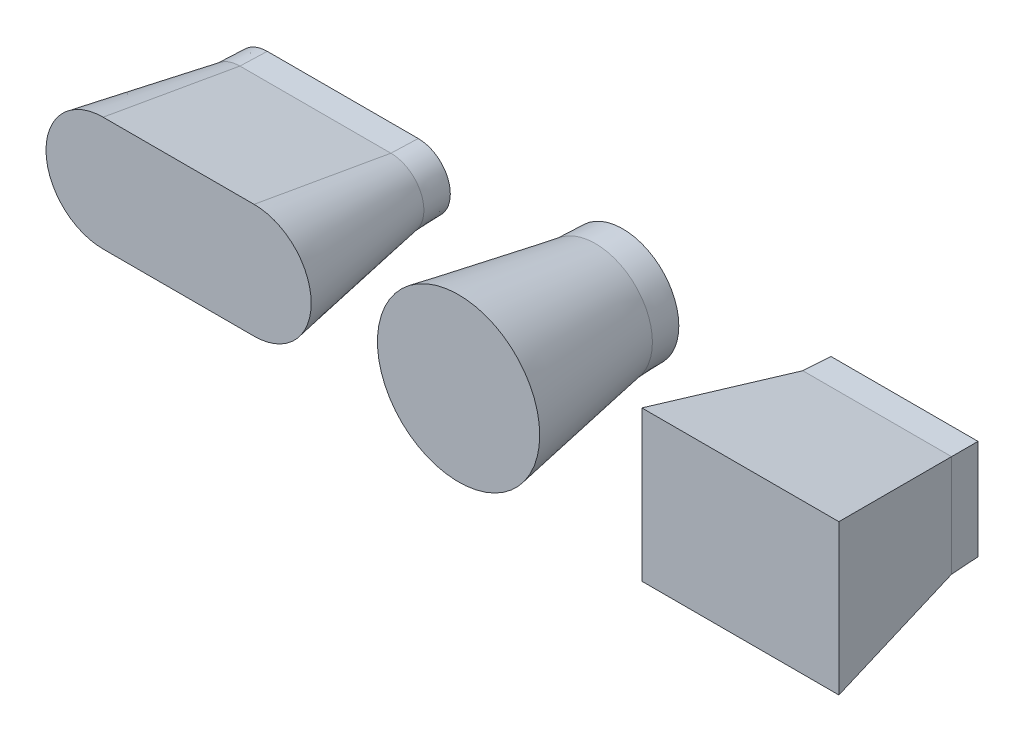
ISO-10303-21;
HEADER;
FILE_DESCRIPTION(('STEP AP214'),'2;1');
FILE_NAME('part.step','',(''),(''),'','','');
FILE_SCHEMA(('AUTOMOTIVE_DESIGN { 1 0 10303 214 1 1 1 1 }'));
ENDSEC;
DATA;
#1=APPLICATION_CONTEXT('core data for automotive mechanical design processes');
#2=APPLICATION_PROTOCOL_DEFINITION('international standard','automotive_design',2000,#1);
#3=PRODUCT_CONTEXT('',#1,'mechanical');
#4=PRODUCT('Part','Part','',(#3));
#5=PRODUCT_RELATED_PRODUCT_CATEGORY('part','',(#4));
#6=PRODUCT_DEFINITION_FORMATION('','',#4);
#7=PRODUCT_DEFINITION_CONTEXT('part definition',#1,'design');
#8=PRODUCT_DEFINITION('design','',#6,#7);
#9=PRODUCT_DEFINITION_SHAPE('','',#8);
#10=(LENGTH_UNIT() NAMED_UNIT(*) SI_UNIT(.MILLI.,.METRE.));
#11=(NAMED_UNIT(*) PLANE_ANGLE_UNIT() SI_UNIT($,.RADIAN.));
#12=(NAMED_UNIT(*) SI_UNIT($,.STERADIAN.) SOLID_ANGLE_UNIT());
#13=UNCERTAINTY_MEASURE_WITH_UNIT(LENGTH_MEASURE(1.E-05),#10,'distance_accuracy_value','');
#14=(GEOMETRIC_REPRESENTATION_CONTEXT(3) GLOBAL_UNCERTAINTY_ASSIGNED_CONTEXT((#13)) GLOBAL_UNIT_ASSIGNED_CONTEXT((#10,
#11,#12)) REPRESENTATION_CONTEXT('',''));
#15=CARTESIAN_POINT('',(0.,0.,0.));
#16=DIRECTION('',(0.,0.,1.));
#17=DIRECTION('',(1.,0.,0.));
#18=AXIS2_PLACEMENT_3D('',#15,#16,#17);
#19=CARTESIAN_POINT('',(49.8176364889845,31.4708187497617,0.));
#20=DIRECTION('',(-0.999390827019096,0.,-0.034899496702501));
#21=DIRECTION('',(-0.034899496702501,0.,0.999390827019096));
#22=AXIS2_PLACEMENT_3D('',#19,#20,#21);
#23=PLANE('',#22);
#24=DIRECTION('',(0.,-1.,0.));
#25=VECTOR('',#24,1.);
#26=CARTESIAN_POINT('',(49.8176364889845,31.4708187497617,0.));
#27=LINE('',#26,#25);
#28=CARTESIAN_POINT('',(49.8176364889845,31.4708187497617,0.));
#29=VERTEX_POINT('',#28);
#30=CARTESIAN_POINT('',(49.8176364889845,-5.7584902393181,0.));
#31=VERTEX_POINT('',#30);
#32=EDGE_CURVE('E107',#29,#31,#27,.T.);
#33=ORIENTED_EDGE('',*,*,#32,.F.);
#34=DIRECTION('',(-0.0348782627423747,0.0348782627423747,0.998782765958718));
#35=VECTOR('',#34,1.);
#36=CARTESIAN_POINT('',(49.8176364889845,31.4708187497617,0.));
#37=LINE('',#36,#35);
#38=CARTESIAN_POINT('',(50.166844183902,31.1216110548443,-10.));
#39=VERTEX_POINT('',#38);
#40=EDGE_CURVE('E12',#39,#29,#37,.T.);
#41=ORIENTED_EDGE('',*,*,#40,.F.);
#42=DIRECTION('',(0.,-1.,0.));
#43=VECTOR('',#42,1.);
#44=CARTESIAN_POINT('',(50.166844183902,0.,-10.));
#45=LINE('',#44,#43);
#46=CARTESIAN_POINT('',(50.166844183902,-5.40928254440062,-10.));
#47=VERTEX_POINT('',#46);
#48=EDGE_CURVE('E130',#39,#47,#45,.T.);
#49=ORIENTED_EDGE('',*,*,#48,.T.);
#50=DIRECTION('',(-0.0348782627423746,-0.0348782627423747,0.998782765958718));
#51=VECTOR('',#50,1.);
#52=CARTESIAN_POINT('',(49.8629256906544,-5.71320103764818,-1.29691305000075));
#53=LINE('',#52,#51);
#54=EDGE_CURVE('E85',#47,#31,#53,.T.);
#55=ORIENTED_EDGE('',*,*,#54,.T.);
#56=EDGE_LOOP('',(#33,#41,#49,#55));
#57=FACE_BOUND('',#56,.T.);
#58=ADVANCED_FACE('F48',(#57),#23,.T.);
#59=CARTESIAN_POINT('',(49.8176364889845,31.4708187497617,0.));
#60=DIRECTION('',(0.,0.999390827019096,-0.034899496702501));
#61=DIRECTION('',(0.,0.034899496702501,0.999390827019096));
#62=AXIS2_PLACEMENT_3D('',#59,#60,#61);
#63=PLANE('',#62);
#64=DIRECTION('',(-1.,0.,0.));
#65=VECTOR('',#64,1.);
#66=CARTESIAN_POINT('',(49.8176364889845,31.4708187497617,0.));
#67=LINE('',#66,#65);
#68=CARTESIAN_POINT('',(104.18849781836,31.4708187497617,0.));
#69=VERTEX_POINT('',#68);
#70=EDGE_CURVE('E117',#69,#29,#67,.T.);
#71=ORIENTED_EDGE('',*,*,#70,.F.);
#72=DIRECTION('',(0.0348782627423747,0.0348782627423747,0.998782765958718));
#73=VECTOR('',#72,1.);
#74=CARTESIAN_POINT('',(104.18849781836,31.4708187497617,0.));
#75=LINE('',#74,#73);
#76=CARTESIAN_POINT('',(103.839290123443,31.1216110548443,-10.));
#77=VERTEX_POINT('',#76);
#78=EDGE_CURVE('E58',#77,#69,#75,.T.);
#79=ORIENTED_EDGE('',*,*,#78,.F.);
#80=DIRECTION('',(-1.,0.,0.));
#81=VECTOR('',#80,1.);
#82=CARTESIAN_POINT('',(0.,31.1216110548443,-10.));
#83=LINE('',#82,#81);
#84=EDGE_CURVE('E120',#77,#39,#83,.T.);
#85=ORIENTED_EDGE('',*,*,#84,.T.);
#86=ORIENTED_EDGE('',*,*,#40,.T.);
#87=EDGE_LOOP('',(#71,#79,#85,#86));
#88=FACE_BOUND('',#87,.T.);
#89=ADVANCED_FACE('F50',(#88),#63,.T.);
#90=CARTESIAN_POINT('',(104.18849781836,31.4708187497617,0.));
#91=DIRECTION('',(0.999390827019096,0.,-0.034899496702501));
#92=DIRECTION('',(-0.034899496702501,0.,-0.999390827019096));
#93=AXIS2_PLACEMENT_3D('',#90,#91,#92);
#94=PLANE('',#93);
#95=DIRECTION('',(0.,1.,0.));
#96=VECTOR('',#95,1.);
#97=CARTESIAN_POINT('',(104.18849781836,31.4708187497617,0.));
#98=LINE('',#97,#96);
#99=CARTESIAN_POINT('',(104.18849781836,-5.7584902393181,0.));
#100=VERTEX_POINT('',#99);
#101=EDGE_CURVE('E131',#100,#69,#98,.T.);
#102=ORIENTED_EDGE('',*,*,#101,.F.);
#103=DIRECTION('',(0.0348782627423747,-0.0348782627423747,0.998782765958718));
#104=VECTOR('',#103,1.);
#105=CARTESIAN_POINT('',(104.122356034626,-5.69234845558434,-1.89405287158383));
#106=LINE('',#105,#104);
#107=CARTESIAN_POINT('',(103.839290123443,-5.40928254440062,-10.));
#108=VERTEX_POINT('',#107);
#109=EDGE_CURVE('E78',#108,#100,#106,.T.);
#110=ORIENTED_EDGE('',*,*,#109,.F.);
#111=DIRECTION('',(0.,1.,0.));
#112=VECTOR('',#111,1.);
#113=CARTESIAN_POINT('',(103.839290123443,0.,-10.));
#114=LINE('',#113,#112);
#115=EDGE_CURVE('E157',#108,#77,#114,.T.);
#116=ORIENTED_EDGE('',*,*,#115,.T.);
#117=ORIENTED_EDGE('',*,*,#78,.T.);
#118=EDGE_LOOP('',(#102,#110,#116,#117));
#119=FACE_BOUND('',#118,.T.);
#120=ADVANCED_FACE('F169',(#119),#94,.T.);
#121=CARTESIAN_POINT('',(49.8176364889845,-5.7584902393181,0.));
#122=DIRECTION('',(0.,-0.999390827019096,-0.034899496702501));
#123=DIRECTION('',(0.,0.034899496702501,-0.999390827019096));
#124=AXIS2_PLACEMENT_3D('',#121,#122,#123);
#125=PLANE('',#124);
#126=DIRECTION('',(1.,0.,0.));
#127=VECTOR('',#126,1.);
#128=CARTESIAN_POINT('',(49.8176364889845,-5.7584902393181,0.));
#129=LINE('',#128,#127);
#130=EDGE_CURVE('E111',#31,#100,#129,.T.);
#131=ORIENTED_EDGE('',*,*,#130,.F.);
#132=ORIENTED_EDGE('',*,*,#54,.F.);
#133=DIRECTION('',(1.,0.,0.));
#134=VECTOR('',#133,1.);
#135=CARTESIAN_POINT('',(0.,-5.40928254440062,-10.));
#136=LINE('',#135,#134);
#137=EDGE_CURVE('E52',#47,#108,#136,.T.);
#138=ORIENTED_EDGE('',*,*,#137,.T.);
#139=ORIENTED_EDGE('',*,*,#109,.T.);
#140=EDGE_LOOP('',(#131,#132,#138,#139));
#141=FACE_BOUND('',#140,.T.);
#142=ADVANCED_FACE('F158',(#141),#125,.T.);
#143=CARTESIAN_POINT('',(0.,0.,-10.));
#144=DIRECTION('',(0.,0.,1.));
#145=DIRECTION('',(1.,0.,0.));
#146=AXIS2_PLACEMENT_3D('',#143,#144,#145);
#147=PLANE('',#146);
#148=ORIENTED_EDGE('',*,*,#48,.F.);
#149=ORIENTED_EDGE('',*,*,#84,.F.);
#150=ORIENTED_EDGE('',*,*,#115,.F.);
#151=ORIENTED_EDGE('',*,*,#137,.F.);
#152=EDGE_LOOP('',(#148,#149,#150,#151));
#153=FACE_BOUND('',#152,.T.);
#154=ADVANCED_FACE('F160',(#153),#147,.F.);
#155=CARTESIAN_POINT('',(49.8176364889845,31.4708187497617,0.));
#156=DIRECTION('',(-0.984807753012208,0.,-0.17364817766693));
#157=DIRECTION('',(-0.17364817766693,0.,0.984807753012208));
#158=AXIS2_PLACEMENT_3D('',#155,#156,#157);
#159=PLANE('',#158);
#160=ORIENTED_EDGE('',*,*,#32,.T.);
#161=DIRECTION('',(0.171087869746036,0.171087869746036,-0.970287525247814));
#162=VECTOR('',#161,1.);
#163=CARTESIAN_POINT('',(49.8176364889845,-5.7584902393181,0.));
#164=LINE('',#163,#162);
#165=CARTESIAN_POINT('',(41.0012874535613,-14.5748392747413,50.));
#166=VERTEX_POINT('',#165);
#167=EDGE_CURVE('E112',#166,#31,#164,.T.);
#168=ORIENTED_EDGE('',*,*,#167,.F.);
#169=DIRECTION('',(0.,1.,0.));
#170=VECTOR('',#169,1.);
#171=CARTESIAN_POINT('',(41.0012874535613,31.4708187497617,50.));
#172=LINE('',#171,#170);
#173=CARTESIAN_POINT('',(41.0012874535613,40.287167785185,50.));
#174=VERTEX_POINT('',#173);
#175=EDGE_CURVE('E135',#174,#166,#172,.F.);
#176=ORIENTED_EDGE('',*,*,#175,.F.);
#177=DIRECTION('',(0.171087869746036,-0.171087869746036,-0.970287525247814));
#178=VECTOR('',#177,1.);
#179=CARTESIAN_POINT('',(49.8176364889845,31.4708187497617,0.));
#180=LINE('',#179,#178);
#181=EDGE_CURVE('E126',#174,#29,#180,.T.);
#182=ORIENTED_EDGE('',*,*,#181,.T.);
#183=EDGE_LOOP('',(#160,#168,#176,#182));
#184=FACE_BOUND('',#183,.T.);
#185=ADVANCED_FACE('F133',(#184),#159,.T.);
#186=CARTESIAN_POINT('',(49.8176364889845,-5.7584902393181,0.));
#187=DIRECTION('',(0.,-0.984807753012208,-0.17364817766693));
#188=DIRECTION('',(0.,0.17364817766693,-0.984807753012208));
#189=AXIS2_PLACEMENT_3D('',#186,#187,#188);
#190=PLANE('',#189);
#191=ORIENTED_EDGE('',*,*,#130,.T.);
#192=DIRECTION('',(-0.171087869746036,0.171087869746036,-0.970287525247814));
#193=VECTOR('',#192,1.);
#194=CARTESIAN_POINT('',(103.098756511925,-4.66874893288281,-6.1802300592729));
#195=LINE('',#194,#193);
#196=CARTESIAN_POINT('',(113.004846853783,-14.5748392747413,50.));
#197=VERTEX_POINT('',#196);
#198=EDGE_CURVE('E138',#197,#100,#195,.T.);
#199=ORIENTED_EDGE('',*,*,#198,.F.);
#200=DIRECTION('',(-1.,0.,0.));
#201=VECTOR('',#200,1.);
#202=CARTESIAN_POINT('',(49.8176364889845,-14.5748392747413,50.));
#203=LINE('',#202,#201);
#204=EDGE_CURVE('E147',#166,#197,#203,.F.);
#205=ORIENTED_EDGE('',*,*,#204,.F.);
#206=ORIENTED_EDGE('',*,*,#167,.T.);
#207=EDGE_LOOP('',(#191,#199,#205,#206));
#208=FACE_BOUND('',#207,.T.);
#209=ADVANCED_FACE('F167',(#208),#190,.T.);
#210=CARTESIAN_POINT('',(104.18849781836,31.4708187497617,0.));
#211=DIRECTION('',(0.984807753012208,0.,-0.17364817766693));
#212=DIRECTION('',(-0.17364817766693,0.,-0.984807753012208));
#213=AXIS2_PLACEMENT_3D('',#210,#211,#212);
#214=PLANE('',#213);
#215=ORIENTED_EDGE('',*,*,#101,.T.);
#216=DIRECTION('',(-0.171087869746036,-0.171087869746036,-0.970287525247814));
#217=VECTOR('',#216,1.);
#218=CARTESIAN_POINT('',(102.597005119034,29.8793260504354,-9.02580361174387));
#219=LINE('',#218,#217);
#220=CARTESIAN_POINT('',(113.004846853783,40.287167785185,50.));
#221=VERTEX_POINT('',#220);
#222=EDGE_CURVE('E129',#221,#69,#219,.T.);
#223=ORIENTED_EDGE('',*,*,#222,.F.);
#224=DIRECTION('',(0.,-1.,0.));
#225=VECTOR('',#224,1.);
#226=CARTESIAN_POINT('',(113.004846853783,31.4708187497617,50.));
#227=LINE('',#226,#225);
#228=EDGE_CURVE('E140',#197,#221,#227,.F.);
#229=ORIENTED_EDGE('',*,*,#228,.F.);
#230=ORIENTED_EDGE('',*,*,#198,.T.);
#231=EDGE_LOOP('',(#215,#223,#229,#230));
#232=FACE_BOUND('',#231,.T.);
#233=ADVANCED_FACE('F185',(#232),#214,.T.);
#234=CARTESIAN_POINT('',(49.8176364889845,31.4708187497617,0.));
#235=DIRECTION('',(0.,0.984807753012208,-0.17364817766693));
#236=DIRECTION('',(0.,0.17364817766693,0.984807753012208));
#237=AXIS2_PLACEMENT_3D('',#234,#235,#236);
#238=PLANE('',#237);
#239=ORIENTED_EDGE('',*,*,#70,.T.);
#240=ORIENTED_EDGE('',*,*,#181,.F.);
#241=DIRECTION('',(1.,0.,0.));
#242=VECTOR('',#241,1.);
#243=CARTESIAN_POINT('',(49.8176364889845,40.287167785185,50.));
#244=LINE('',#243,#242);
#245=EDGE_CURVE('E136',#221,#174,#244,.F.);
#246=ORIENTED_EDGE('',*,*,#245,.F.);
#247=ORIENTED_EDGE('',*,*,#222,.T.);
#248=EDGE_LOOP('',(#239,#240,#246,#247));
#249=FACE_BOUND('',#248,.T.);
#250=ADVANCED_FACE('F124',(#249),#238,.T.);
#251=CARTESIAN_POINT('',(0.,0.,50.));
#252=DIRECTION('',(0.,0.,1.));
#253=DIRECTION('',(1.,0.,0.));
#254=AXIS2_PLACEMENT_3D('',#251,#252,#253);
#255=PLANE('',#254);
#256=ORIENTED_EDGE('',*,*,#175,.T.);
#257=ORIENTED_EDGE('',*,*,#204,.T.);
#258=ORIENTED_EDGE('',*,*,#228,.T.);
#259=ORIENTED_EDGE('',*,*,#245,.T.);
#260=EDGE_LOOP('',(#256,#257,#258,#259));
#261=FACE_BOUND('',#260,.T.);
#262=ADVANCED_FACE('F187',(#261),#255,.T.);
#263=CLOSED_SHELL('',(#58,#89,#120,#142,#154,#185,#209,#233,#250,#262));
#264=MANIFOLD_SOLID_BREP('B2',#263);
#265=CARTESIAN_POINT('',(-25.9801652657607,12.9900826328804,0.));
#266=DIRECTION('',(0.,0.,1.));
#267=DIRECTION('',(1.,0.,0.));
#268=AXIS2_PLACEMENT_3D('',#265,#266,#267);
#269=CONICAL_SURFACE('',#268,20.8362536081408,0.0349065850398866);
#270=CARTESIAN_POINT('',(-25.9801652657607,12.9900826328804,-10.));
#271=DIRECTION('',(0.,0.,1.));
#272=DIRECTION('',(1.,0.,0.));
#273=AXIS2_PLACEMENT_3D('',#270,#271,#272);
#274=CIRCLE('',#273,20.4870459132233);
#275=CARTESIAN_POINT('',(-5.49311935253747,12.9900826328804,-10.));
#276=VERTEX_POINT('',#275);
#277=EDGE_CURVE('E47',#276,#276,#274,.T.);
#278=ORIENTED_EDGE('',*,*,#277,.T.);
#279=EDGE_LOOP('',(#278));
#280=FACE_BOUND('',#279,.T.);
#281=CARTESIAN_POINT('',(-25.9801652657607,12.9900826328804,0.));
#282=DIRECTION('',(0.,0.,1.));
#283=DIRECTION('',(1.,0.,0.));
#284=AXIS2_PLACEMENT_3D('',#281,#282,#283);
#285=CIRCLE('',#284,20.8362536081408);
#286=CARTESIAN_POINT('',(-5.14391165761999,12.9900826328804,0.));
#287=VERTEX_POINT('',#286);
#288=EDGE_CURVE('E295',#287,#287,#285,.T.);
#289=ORIENTED_EDGE('',*,*,#288,.F.);
#290=EDGE_LOOP('',(#289));
#291=FACE_BOUND('',#290,.T.);
#292=ADVANCED_FACE('F289',(#280,#291),#269,.T.);
#293=CARTESIAN_POINT('',(-25.9801652657607,12.9900826328804,-10.));
#294=DIRECTION('',(0.,0.,1.));
#295=DIRECTION('',(1.,0.,0.));
#296=AXIS2_PLACEMENT_3D('',#293,#294,#295);
#297=PLANE('',#296);
#298=ORIENTED_EDGE('',*,*,#277,.F.);
#299=EDGE_LOOP('',(#298));
#300=FACE_BOUND('',#299,.T.);
#301=ADVANCED_FACE('F310',(#300),#297,.F.);
#302=CARTESIAN_POINT('',(-25.9801652657607,12.9900826328804,0.));
#303=DIRECTION('',(0.,0.,1.));
#304=DIRECTION('',(1.,0.,0.));
#305=AXIS2_PLACEMENT_3D('',#302,#303,#304);
#306=CONICAL_SURFACE('',#305,20.8362536081408,0.174532925199433);
#307=CARTESIAN_POINT('',(-25.9801652657607,12.9900826328804,50.));
#308=DIRECTION('',(0.,0.,1.));
#309=DIRECTION('',(1.,0.,0.));
#310=AXIS2_PLACEMENT_3D('',#307,#308,#309);
#311=CIRCLE('',#310,29.652602643564);
#312=CARTESIAN_POINT('',(3.67243737780327,12.9900826328804,50.));
#313=VERTEX_POINT('',#312);
#314=EDGE_CURVE('E299',#313,#313,#311,.T.);
#315=ORIENTED_EDGE('',*,*,#314,.F.);
#316=EDGE_LOOP('',(#315));
#317=FACE_BOUND('',#316,.T.);
#318=ORIENTED_EDGE('',*,*,#288,.T.);
#319=EDGE_LOOP('',(#318));
#320=FACE_BOUND('',#319,.T.);
#321=ADVANCED_FACE('F308',(#317,#320),#306,.T.);
#322=CARTESIAN_POINT('',(-25.9801652657607,12.9900826328804,50.));
#323=DIRECTION('',(0.,0.,1.));
#324=DIRECTION('',(1.,0.,0.));
#325=AXIS2_PLACEMENT_3D('',#322,#323,#324);
#326=PLANE('',#325);
#327=ORIENTED_EDGE('',*,*,#314,.T.);
#328=EDGE_LOOP('',(#327));
#329=FACE_BOUND('',#328,.T.);
#330=ADVANCED_FACE('F306',(#329),#326,.T.);
#331=CLOSED_SHELL('',(#292,#301,#321,#330));
#332=MANIFOLD_SOLID_BREP('B6',#331);
#333=CARTESIAN_POINT('',(-155.880991594565,12.9900826328804,0.));
#334=DIRECTION('',(0.,0.,1.));
#335=DIRECTION('',(1.,0.,0.));
#336=AXIS2_PLACEMENT_3D('',#333,#334,#335);
#337=CONICAL_SURFACE('',#336,12.0526539892705,0.0349065850398866);
#338=CARTESIAN_POINT('',(-155.880991594565,12.9900826328804,0.));
#339=DIRECTION('',(0.,0.,1.));
#340=DIRECTION('',(1.,0.,0.));
#341=AXIS2_PLACEMENT_3D('',#338,#339,#340);
#342=CIRCLE('',#341,12.0526539892705);
#343=CARTESIAN_POINT('',(-155.880991594565,25.0427366221508,0.));
#344=VERTEX_POINT('',#343);
#345=CARTESIAN_POINT('',(-155.880991594565,0.937428643609933,0.));
#346=VERTEX_POINT('',#345);
#347=EDGE_CURVE('E413',#344,#346,#342,.T.);
#348=ORIENTED_EDGE('',*,*,#347,.F.);
#349=DIRECTION('',(0.,0.034899496702501,0.999390827019096));
#350=VECTOR('',#349,1.);
#351=CARTESIAN_POINT('',(-155.880991594565,25.0427366221508,0.));
#352=LINE('',#351,#350);
#353=CARTESIAN_POINT('',(-155.880991594565,24.6935289272334,-10.));
#354=VERTEX_POINT('',#353);
#355=EDGE_CURVE('E287',#354,#344,#352,.T.);
#356=ORIENTED_EDGE('',*,*,#355,.F.);
#357=CARTESIAN_POINT('',(-155.880991594565,12.9900826328804,-10.));
#358=DIRECTION('',(0.,0.,1.));
#359=DIRECTION('',(1.,0.,0.));
#360=AXIS2_PLACEMENT_3D('',#357,#358,#359);
#361=CIRCLE('',#360,11.703446294353);
#362=CARTESIAN_POINT('',(-155.880991594565,1.28663633852741,-10.));
#363=VERTEX_POINT('',#362);
#364=EDGE_CURVE('E436',#354,#363,#361,.T.);
#365=ORIENTED_EDGE('',*,*,#364,.T.);
#366=DIRECTION('',(0.,-0.034899496702501,0.999390827019096));
#367=VECTOR('',#366,1.);
#368=CARTESIAN_POINT('',(-155.880991594565,0.937428643609933,0.));
#369=LINE('',#368,#367);
#370=EDGE_CURVE('E391',#363,#346,#369,.T.);
#371=ORIENTED_EDGE('',*,*,#370,.T.);
#372=EDGE_LOOP('',(#348,#356,#365,#371));
#373=FACE_BOUND('',#372,.T.);
#374=ADVANCED_FACE('F354',(#373),#337,.T.);
#375=CARTESIAN_POINT('',(-155.880991594565,25.0427366221508,0.));
#376=DIRECTION('',(0.,0.999390827019096,-0.034899496702501));
#377=DIRECTION('',(0.,0.034899496702501,0.999390827019096));
#378=AXIS2_PLACEMENT_3D('',#375,#376,#377);
#379=PLANE('',#378);
#380=DIRECTION('',(-1.,0.,0.));
#381=VECTOR('',#380,1.);
#382=CARTESIAN_POINT('',(-155.880991594565,25.0427366221508,0.));
#383=LINE('',#382,#381);
#384=CARTESIAN_POINT('',(-100.706619999238,25.0427366221508,0.));
#385=VERTEX_POINT('',#384);
#386=EDGE_CURVE('E423',#385,#344,#383,.T.);
#387=ORIENTED_EDGE('',*,*,#386,.F.);
#388=DIRECTION('',(0.,0.034899496702501,0.999390827019096));
#389=VECTOR('',#388,1.);
#390=CARTESIAN_POINT('',(-100.706619999238,25.0427366221508,0.));
#391=LINE('',#390,#389);
#392=CARTESIAN_POINT('',(-100.706619999238,24.6935289272334,-10.));
#393=VERTEX_POINT('',#392);
#394=EDGE_CURVE('E364',#393,#385,#391,.T.);
#395=ORIENTED_EDGE('',*,*,#394,.F.);
#396=DIRECTION('',(-1.,0.,0.));
#397=VECTOR('',#396,1.);
#398=CARTESIAN_POINT('',(-155.880991594565,24.6935289272334,-10.));
#399=LINE('',#398,#397);
#400=EDGE_CURVE('E426',#393,#354,#399,.T.);
#401=ORIENTED_EDGE('',*,*,#400,.T.);
#402=ORIENTED_EDGE('',*,*,#355,.T.);
#403=EDGE_LOOP('',(#387,#395,#401,#402));
#404=FACE_BOUND('',#403,.T.);
#405=ADVANCED_FACE('F356',(#404),#379,.T.);
#406=CARTESIAN_POINT('',(-100.706619999238,12.9900826328804,0.));
#407=DIRECTION('',(0.,0.,1.));
#408=DIRECTION('',(1.,0.,0.));
#409=AXIS2_PLACEMENT_3D('',#406,#407,#408);
#410=CONICAL_SURFACE('',#409,12.0526539892705,0.0349065850398866);
#411=CARTESIAN_POINT('',(-100.706619999238,12.9900826328804,0.));
#412=DIRECTION('',(0.,0.,1.));
#413=DIRECTION('',(1.,0.,0.));
#414=AXIS2_PLACEMENT_3D('',#411,#412,#413);
#415=CIRCLE('',#414,12.0526539892705);
#416=CARTESIAN_POINT('',(-100.706619999238,0.937428643609933,0.));
#417=VERTEX_POINT('',#416);
#418=EDGE_CURVE('E437',#417,#385,#415,.T.);
#419=ORIENTED_EDGE('',*,*,#418,.F.);
#420=DIRECTION('',(0.,-0.034899496702501,0.999390827019096));
#421=VECTOR('',#420,1.);
#422=CARTESIAN_POINT('',(-100.706619999238,0.937428643609933,0.));
#423=LINE('',#422,#421);
#424=CARTESIAN_POINT('',(-100.706619999238,1.28663633852741,-10.));
#425=VERTEX_POINT('',#424);
#426=EDGE_CURVE('E384',#425,#417,#423,.T.);
#427=ORIENTED_EDGE('',*,*,#426,.F.);
#428=CARTESIAN_POINT('',(-100.706619999238,12.9900826328804,-10.));
#429=DIRECTION('',(0.,0.,1.));
#430=DIRECTION('',(1.,0.,0.));
#431=AXIS2_PLACEMENT_3D('',#428,#429,#430);
#432=CIRCLE('',#431,11.703446294353);
#433=EDGE_CURVE('E459',#425,#393,#432,.T.);
#434=ORIENTED_EDGE('',*,*,#433,.T.);
#435=ORIENTED_EDGE('',*,*,#394,.T.);
#436=EDGE_LOOP('',(#419,#427,#434,#435));
#437=FACE_BOUND('',#436,.T.);
#438=ADVANCED_FACE('F471',(#437),#410,.T.);
#439=CARTESIAN_POINT('',(-155.880991594565,0.937428643609933,0.));
#440=DIRECTION('',(0.,-0.999390827019096,-0.034899496702501));
#441=DIRECTION('',(0.,0.034899496702501,-0.999390827019096));
#442=AXIS2_PLACEMENT_3D('',#439,#440,#441);
#443=PLANE('',#442);
#444=DIRECTION('',(1.,0.,0.));
#445=VECTOR('',#444,1.);
#446=CARTESIAN_POINT('',(-155.880991594565,0.937428643609933,0.));
#447=LINE('',#446,#445);
#448=EDGE_CURVE('E417',#346,#417,#447,.T.);
#449=ORIENTED_EDGE('',*,*,#448,.F.);
#450=ORIENTED_EDGE('',*,*,#370,.F.);
#451=DIRECTION('',(1.,0.,0.));
#452=VECTOR('',#451,1.);
#453=CARTESIAN_POINT('',(-155.880991594565,1.28663633852741,-10.));
#454=LINE('',#453,#452);
#455=EDGE_CURVE('E358',#363,#425,#454,.T.);
#456=ORIENTED_EDGE('',*,*,#455,.T.);
#457=ORIENTED_EDGE('',*,*,#426,.T.);
#458=EDGE_LOOP('',(#449,#450,#456,#457));
#459=FACE_BOUND('',#458,.T.);
#460=ADVANCED_FACE('F460',(#459),#443,.T.);
#461=CARTESIAN_POINT('',(-155.880991594565,12.9900826328804,-10.));
#462=DIRECTION('',(0.,0.,1.));
#463=DIRECTION('',(1.,0.,0.));
#464=AXIS2_PLACEMENT_3D('',#461,#462,#463);
#465=PLANE('',#464);
#466=ORIENTED_EDGE('',*,*,#364,.F.);
#467=ORIENTED_EDGE('',*,*,#400,.F.);
#468=ORIENTED_EDGE('',*,*,#433,.F.);
#469=ORIENTED_EDGE('',*,*,#455,.F.);
#470=EDGE_LOOP('',(#466,#467,#468,#469));
#471=FACE_BOUND('',#470,.T.);
#472=ADVANCED_FACE('F462',(#471),#465,.F.);
#473=CARTESIAN_POINT('',(-155.880991594565,12.9900826328804,0.));
#474=DIRECTION('',(0.,0.,1.));
#475=DIRECTION('',(1.,0.,0.));
#476=AXIS2_PLACEMENT_3D('',#473,#474,#475);
#477=CONICAL_SURFACE('',#476,12.0526539892705,0.174532925199433);
#478=ORIENTED_EDGE('',*,*,#347,.T.);
#479=DIRECTION('',(0.,-0.17364817766693,0.984807753012208));
#480=VECTOR('',#479,1.);
#481=CARTESIAN_POINT('',(-155.880991594565,0.937428643609933,0.));
#482=LINE('',#481,#480);
#483=CARTESIAN_POINT('',(-155.880991594565,-7.87892039181332,50.));
#484=VERTEX_POINT('',#483);
#485=EDGE_CURVE('E418',#484,#346,#482,.F.);
#486=ORIENTED_EDGE('',*,*,#485,.F.);
#487=CARTESIAN_POINT('',(-155.880991594565,12.9900826328804,50.));
#488=DIRECTION('',(0.,0.,1.));
#489=DIRECTION('',(1.,0.,0.));
#490=AXIS2_PLACEMENT_3D('',#487,#488,#489);
#491=CIRCLE('',#490,20.8690030246937);
#492=CARTESIAN_POINT('',(-155.880991594565,33.8590856575741,50.));
#493=VERTEX_POINT('',#492);
#494=EDGE_CURVE('E441',#493,#484,#491,.T.);
#495=ORIENTED_EDGE('',*,*,#494,.F.);
#496=DIRECTION('',(0.,0.17364817766693,0.984807753012208));
#497=VECTOR('',#496,1.);
#498=CARTESIAN_POINT('',(-155.880991594565,25.0427366221508,0.));
#499=LINE('',#498,#497);
#500=EDGE_CURVE('E432',#493,#344,#499,.F.);
#501=ORIENTED_EDGE('',*,*,#500,.T.);
#502=EDGE_LOOP('',(#478,#486,#495,#501));
#503=FACE_BOUND('',#502,.T.);
#504=ADVANCED_FACE('F439',(#503),#477,.T.);
#505=CARTESIAN_POINT('',(-155.880991594565,0.937428643609933,0.));
#506=DIRECTION('',(0.,-0.984807753012208,-0.17364817766693));
#507=DIRECTION('',(0.,0.17364817766693,-0.984807753012208));
#508=AXIS2_PLACEMENT_3D('',#505,#506,#507);
#509=PLANE('',#508);
#510=ORIENTED_EDGE('',*,*,#448,.T.);
#511=DIRECTION('',(0.,-0.17364817766693,0.984807753012208));
#512=VECTOR('',#511,1.);
#513=CARTESIAN_POINT('',(-100.706619999238,0.937428643609933,0.));
#514=LINE('',#513,#512);
#515=CARTESIAN_POINT('',(-100.706619999238,-7.87892039181332,50.));
#516=VERTEX_POINT('',#515);
#517=EDGE_CURVE('E444',#516,#417,#514,.F.);
#518=ORIENTED_EDGE('',*,*,#517,.F.);
#519=DIRECTION('',(-1.,0.,0.));
#520=VECTOR('',#519,1.);
#521=CARTESIAN_POINT('',(-155.880991594565,-7.87892039181332,50.));
#522=LINE('',#521,#520);
#523=EDGE_CURVE('E489',#484,#516,#522,.F.);
#524=ORIENTED_EDGE('',*,*,#523,.F.);
#525=ORIENTED_EDGE('',*,*,#485,.T.);
#526=EDGE_LOOP('',(#510,#518,#524,#525));
#527=FACE_BOUND('',#526,.T.);
#528=ADVANCED_FACE('F469',(#527),#509,.T.);
#529=CARTESIAN_POINT('',(-100.706619999238,12.9900826328804,0.));
#530=DIRECTION('',(0.,0.,1.));
#531=DIRECTION('',(1.,0.,0.));
#532=AXIS2_PLACEMENT_3D('',#529,#530,#531);
#533=CONICAL_SURFACE('',#532,12.0526539892705,0.174532925199433);
#534=ORIENTED_EDGE('',*,*,#418,.T.);
#535=DIRECTION('',(0.,0.17364817766693,0.984807753012208));
#536=VECTOR('',#535,1.);
#537=CARTESIAN_POINT('',(-100.706619999238,25.0427366221508,0.));
#538=LINE('',#537,#536);
#539=CARTESIAN_POINT('',(-100.706619999238,33.8590856575741,50.));
#540=VERTEX_POINT('',#539);
#541=EDGE_CURVE('E435',#540,#385,#538,.F.);
#542=ORIENTED_EDGE('',*,*,#541,.F.);
#543=CARTESIAN_POINT('',(-100.706619999238,12.9900826328804,50.));
#544=DIRECTION('',(0.,0.,1.));
#545=DIRECTION('',(1.,0.,0.));
#546=AXIS2_PLACEMENT_3D('',#543,#544,#545);
#547=CIRCLE('',#546,20.8690030246937);
#548=EDGE_CURVE('E446',#516,#540,#547,.T.);
#549=ORIENTED_EDGE('',*,*,#548,.F.);
#550=ORIENTED_EDGE('',*,*,#517,.T.);
#551=EDGE_LOOP('',(#534,#542,#549,#550));
#552=FACE_BOUND('',#551,.T.);
#553=ADVANCED_FACE('F487',(#552),#533,.T.);
#554=CARTESIAN_POINT('',(-155.880991594565,25.0427366221508,0.));
#555=DIRECTION('',(0.,0.984807753012208,-0.17364817766693));
#556=DIRECTION('',(0.,0.17364817766693,0.984807753012208));
#557=AXIS2_PLACEMENT_3D('',#554,#555,#556);
#558=PLANE('',#557);
#559=ORIENTED_EDGE('',*,*,#386,.T.);
#560=ORIENTED_EDGE('',*,*,#500,.F.);
#561=DIRECTION('',(1.,0.,0.));
#562=VECTOR('',#561,1.);
#563=CARTESIAN_POINT('',(-155.880991594565,33.8590856575741,50.));
#564=LINE('',#563,#562);
#565=EDGE_CURVE('E442',#540,#493,#564,.F.);
#566=ORIENTED_EDGE('',*,*,#565,.F.);
#567=ORIENTED_EDGE('',*,*,#541,.T.);
#568=EDGE_LOOP('',(#559,#560,#566,#567));
#569=FACE_BOUND('',#568,.T.);
#570=ADVANCED_FACE('F430',(#569),#558,.T.);
#571=CARTESIAN_POINT('',(-155.880991594565,12.9900826328804,50.));
#572=DIRECTION('',(0.,0.,1.));
#573=DIRECTION('',(1.,0.,0.));
#574=AXIS2_PLACEMENT_3D('',#571,#572,#573);
#575=PLANE('',#574);
#576=ORIENTED_EDGE('',*,*,#494,.T.);
#577=ORIENTED_EDGE('',*,*,#523,.T.);
#578=ORIENTED_EDGE('',*,*,#548,.T.);
#579=ORIENTED_EDGE('',*,*,#565,.T.);
#580=EDGE_LOOP('',(#576,#577,#578,#579));
#581=FACE_BOUND('',#580,.T.);
#582=ADVANCED_FACE('F493',(#581),#575,.T.);
#583=CLOSED_SHELL('',(#374,#405,#438,#460,#472,#504,#528,#553,#570,#582));
#584=MANIFOLD_SOLID_BREP('B42',#583);
#585=ADVANCED_BREP_SHAPE_REPRESENTATION('',(#18,#264,#332,#584),#14);
#586=SHAPE_DEFINITION_REPRESENTATION(#9,#585);
ENDSEC;
END-ISO-10303-21;
